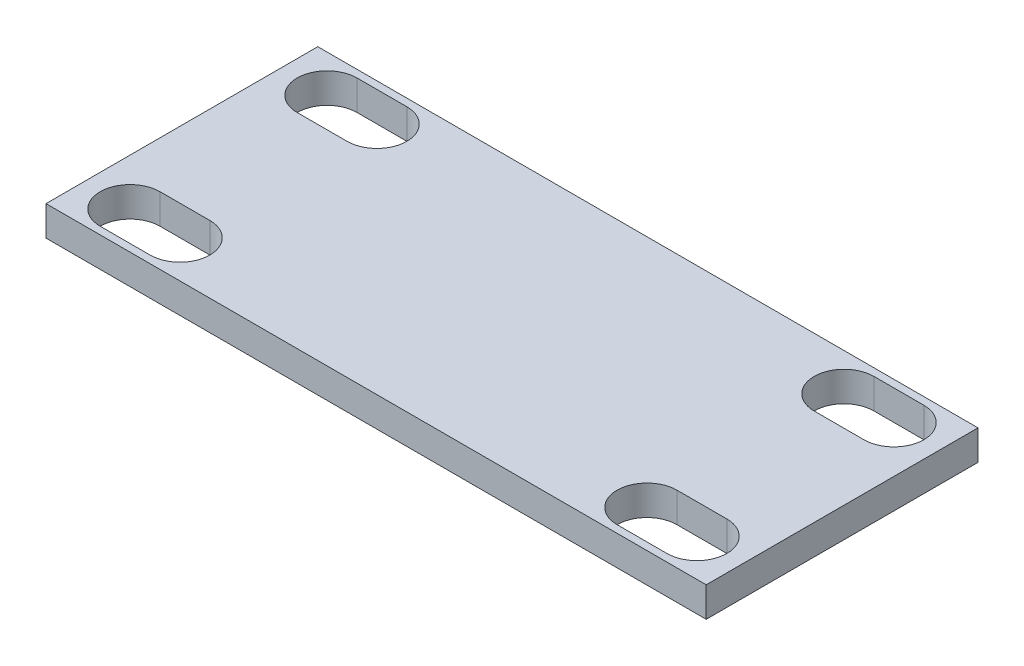
ISO-10303-21;
HEADER;
FILE_DESCRIPTION(('STEP AP214'),'2;1');
FILE_NAME('part.step','',(''),(''),'','','');
FILE_SCHEMA(('AUTOMOTIVE_DESIGN { 1 0 10303 214 1 1 1 1 }'));
ENDSEC;
DATA;
#1=APPLICATION_CONTEXT('core data for automotive mechanical design processes');
#2=APPLICATION_PROTOCOL_DEFINITION('international standard','automotive_design',2000,#1);
#3=PRODUCT_CONTEXT('',#1,'mechanical');
#4=PRODUCT('Part','Part','',(#3));
#5=PRODUCT_RELATED_PRODUCT_CATEGORY('part','',(#4));
#6=PRODUCT_DEFINITION_FORMATION('','',#4);
#7=PRODUCT_DEFINITION_CONTEXT('part definition',#1,'design');
#8=PRODUCT_DEFINITION('design','',#6,#7);
#9=PRODUCT_DEFINITION_SHAPE('','',#8);
#10=(LENGTH_UNIT() NAMED_UNIT(*) SI_UNIT(.MILLI.,.METRE.));
#11=(NAMED_UNIT(*) PLANE_ANGLE_UNIT() SI_UNIT($,.RADIAN.));
#12=(NAMED_UNIT(*) SI_UNIT($,.STERADIAN.) SOLID_ANGLE_UNIT());
#13=UNCERTAINTY_MEASURE_WITH_UNIT(LENGTH_MEASURE(1.E-05),#10,'distance_accuracy_value','');
#14=(GEOMETRIC_REPRESENTATION_CONTEXT(3) GLOBAL_UNCERTAINTY_ASSIGNED_CONTEXT((#13)) GLOBAL_UNIT_ASSIGNED_CONTEXT((#10,
#11,#12)) REPRESENTATION_CONTEXT('',''));
#15=CARTESIAN_POINT('',(0.,0.,0.));
#16=DIRECTION('',(0.,0.,1.));
#17=DIRECTION('',(1.,0.,0.));
#18=AXIS2_PLACEMENT_3D('',#15,#16,#17);
#19=CARTESIAN_POINT('',(0.,3.,0.));
#20=DIRECTION('',(0.,1.,0.));
#21=DIRECTION('',(0.,0.,1.));
#22=AXIS2_PLACEMENT_3D('',#19,#20,#21);
#23=PLANE('',#22);
#24=DIRECTION('',(0.,0.,-1.));
#25=VECTOR('',#24,1.);
#26=CARTESIAN_POINT('',(33.095,3.,-13.625));
#27=LINE('',#26,#25);
#28=CARTESIAN_POINT('',(33.095,3.,13.625));
#29=VERTEX_POINT('',#28);
#30=CARTESIAN_POINT('',(33.095,3.,-13.625));
#31=VERTEX_POINT('',#30);
#32=EDGE_CURVE('E302',#29,#31,#27,.T.);
#33=ORIENTED_EDGE('',*,*,#32,.T.);
#34=DIRECTION('',(-1.,0.,0.));
#35=VECTOR('',#34,1.);
#36=CARTESIAN_POINT('',(-33.095,3.,-13.625));
#37=LINE('',#36,#35);
#38=CARTESIAN_POINT('',(-33.095,3.,-13.625));
#39=VERTEX_POINT('',#38);
#40=EDGE_CURVE('E305',#31,#39,#37,.T.);
#41=ORIENTED_EDGE('',*,*,#40,.T.);
#42=DIRECTION('',(0.,0.,1.));
#43=VECTOR('',#42,1.);
#44=CARTESIAN_POINT('',(-33.095,3.,-13.625));
#45=LINE('',#44,#43);
#46=CARTESIAN_POINT('',(-33.095,3.,13.625));
#47=VERTEX_POINT('',#46);
#48=EDGE_CURVE('E308',#39,#47,#45,.T.);
#49=ORIENTED_EDGE('',*,*,#48,.T.);
#50=DIRECTION('',(1.,0.,0.));
#51=VECTOR('',#50,1.);
#52=CARTESIAN_POINT('',(-33.095,3.,13.625));
#53=LINE('',#52,#51);
#54=EDGE_CURVE('E310',#47,#29,#53,.T.);
#55=ORIENTED_EDGE('',*,*,#54,.T.);
#56=EDGE_LOOP('',(#33,#41,#49,#55));
#57=FACE_BOUND('',#56,.T.);
#58=DIRECTION('',(1.,0.,0.));
#59=VECTOR('',#58,1.);
#60=CARTESIAN_POINT('',(-28.4129443800947,3.,-6.875));
#61=LINE('',#60,#59);
#62=CARTESIAN_POINT('',(-28.4129443800947,3.,-6.875));
#63=VERTEX_POINT('',#62);
#64=CARTESIAN_POINT('',(-23.4129443800947,3.,-6.875));
#65=VERTEX_POINT('',#64);
#66=EDGE_CURVE('E273',#63,#65,#61,.T.);
#67=ORIENTED_EDGE('',*,*,#66,.F.);
#68=CARTESIAN_POINT('',(-28.4129443800947,3.,-9.875));
#69=DIRECTION('',(0.,1.,0.));
#70=DIRECTION('',(0.,0.,1.));
#71=AXIS2_PLACEMENT_3D('',#68,#69,#70);
#72=CIRCLE('',#71,3.);
#73=CARTESIAN_POINT('',(-28.4129443800947,3.,-12.875));
#74=VERTEX_POINT('',#73);
#75=EDGE_CURVE('E271',#74,#63,#72,.T.);
#76=ORIENTED_EDGE('',*,*,#75,.F.);
#77=DIRECTION('',(-1.,0.,0.));
#78=VECTOR('',#77,1.);
#79=CARTESIAN_POINT('',(-28.4129443800947,3.,-12.875));
#80=LINE('',#79,#78);
#81=CARTESIAN_POINT('',(-23.4129443800947,3.,-12.875));
#82=VERTEX_POINT('',#81);
#83=EDGE_CURVE('E279',#82,#74,#80,.T.);
#84=ORIENTED_EDGE('',*,*,#83,.F.);
#85=CARTESIAN_POINT('',(-23.4129443800947,3.,-9.875));
#86=DIRECTION('',(0.,1.,0.));
#87=DIRECTION('',(0.,0.,1.));
#88=AXIS2_PLACEMENT_3D('',#85,#86,#87);
#89=CIRCLE('',#88,3.);
#90=EDGE_CURVE('E276',#65,#82,#89,.T.);
#91=ORIENTED_EDGE('',*,*,#90,.F.);
#92=EDGE_LOOP('',(#67,#76,#84,#91));
#93=FACE_BOUND('',#92,.T.);
#94=DIRECTION('',(-1.,0.,0.));
#95=VECTOR('',#94,1.);
#96=CARTESIAN_POINT('',(28.4129443800946,3.,-12.875));
#97=LINE('',#96,#95);
#98=CARTESIAN_POINT('',(28.4129443800946,3.,-12.875));
#99=VERTEX_POINT('',#98);
#100=CARTESIAN_POINT('',(23.4129443800946,3.,-12.875));
#101=VERTEX_POINT('',#100);
#102=EDGE_CURVE('E242',#99,#101,#97,.T.);
#103=ORIENTED_EDGE('',*,*,#102,.F.);
#104=CARTESIAN_POINT('',(28.4129443800946,3.,-9.875));
#105=DIRECTION('',(0.,1.,0.));
#106=DIRECTION('',(0.,0.,-1.));
#107=AXIS2_PLACEMENT_3D('',#104,#105,#106);
#108=CIRCLE('',#107,3.);
#109=CARTESIAN_POINT('',(28.4129443800946,3.,-6.875));
#110=VERTEX_POINT('',#109);
#111=EDGE_CURVE('E240',#110,#99,#108,.T.);
#112=ORIENTED_EDGE('',*,*,#111,.F.);
#113=DIRECTION('',(1.,0.,0.));
#114=VECTOR('',#113,1.);
#115=CARTESIAN_POINT('',(28.4129443800946,3.,-6.875));
#116=LINE('',#115,#114);
#117=CARTESIAN_POINT('',(23.4129443800946,3.,-6.875));
#118=VERTEX_POINT('',#117);
#119=EDGE_CURVE('E248',#118,#110,#116,.T.);
#120=ORIENTED_EDGE('',*,*,#119,.F.);
#121=CARTESIAN_POINT('',(23.4129443800946,3.,-9.875));
#122=DIRECTION('',(0.,1.,0.));
#123=DIRECTION('',(0.,0.,-1.));
#124=AXIS2_PLACEMENT_3D('',#121,#122,#123);
#125=CIRCLE('',#124,3.);
#126=EDGE_CURVE('E245',#101,#118,#125,.T.);
#127=ORIENTED_EDGE('',*,*,#126,.F.);
#128=EDGE_LOOP('',(#103,#112,#120,#127));
#129=FACE_BOUND('',#128,.T.);
#130=DIRECTION('',(1.,0.,0.));
#131=VECTOR('',#130,1.);
#132=CARTESIAN_POINT('',(-28.4129443800947,3.,12.875));
#133=LINE('',#132,#131);
#134=CARTESIAN_POINT('',(-28.4129443800947,3.,12.875));
#135=VERTEX_POINT('',#134);
#136=CARTESIAN_POINT('',(-23.4129443800947,3.,12.875));
#137=VERTEX_POINT('',#136);
#138=EDGE_CURVE('E211',#135,#137,#133,.T.);
#139=ORIENTED_EDGE('',*,*,#138,.F.);
#140=CARTESIAN_POINT('',(-28.4129443800947,3.,9.87500000000001));
#141=DIRECTION('',(0.,1.,0.));
#142=DIRECTION('',(0.,0.,-1.));
#143=AXIS2_PLACEMENT_3D('',#140,#141,#142);
#144=CIRCLE('',#143,3.);
#145=CARTESIAN_POINT('',(-28.4129443800947,3.,6.87500000000001));
#146=VERTEX_POINT('',#145);
#147=EDGE_CURVE('E209',#146,#135,#144,.T.);
#148=ORIENTED_EDGE('',*,*,#147,.F.);
#149=DIRECTION('',(-1.,0.,0.));
#150=VECTOR('',#149,1.);
#151=CARTESIAN_POINT('',(-28.4129443800947,3.,6.87500000000001));
#152=LINE('',#151,#150);
#153=CARTESIAN_POINT('',(-23.4129443800947,3.,6.87500000000001));
#154=VERTEX_POINT('',#153);
#155=EDGE_CURVE('E217',#154,#146,#152,.T.);
#156=ORIENTED_EDGE('',*,*,#155,.F.);
#157=CARTESIAN_POINT('',(-23.4129443800947,3.,9.87500000000001));
#158=DIRECTION('',(0.,1.,0.));
#159=DIRECTION('',(0.,0.,-1.));
#160=AXIS2_PLACEMENT_3D('',#157,#158,#159);
#161=CIRCLE('',#160,3.);
#162=EDGE_CURVE('E214',#137,#154,#161,.T.);
#163=ORIENTED_EDGE('',*,*,#162,.F.);
#164=EDGE_LOOP('',(#139,#148,#156,#163));
#165=FACE_BOUND('',#164,.T.);
#166=DIRECTION('',(-1.,0.,0.));
#167=VECTOR('',#166,1.);
#168=CARTESIAN_POINT('',(28.4129443800946,3.,6.87500000000001));
#169=LINE('',#168,#167);
#170=CARTESIAN_POINT('',(28.4129443800946,3.,6.87500000000001));
#171=VERTEX_POINT('',#170);
#172=CARTESIAN_POINT('',(23.4129443800946,3.,6.87500000000001));
#173=VERTEX_POINT('',#172);
#174=EDGE_CURVE('E181',#171,#173,#169,.T.);
#175=ORIENTED_EDGE('',*,*,#174,.F.);
#176=CARTESIAN_POINT('',(28.4129443800946,3.,9.87500000000001));
#177=DIRECTION('',(0.,1.,0.));
#178=DIRECTION('',(0.,0.,1.));
#179=AXIS2_PLACEMENT_3D('',#176,#177,#178);
#180=CIRCLE('',#179,3.);
#181=CARTESIAN_POINT('',(28.4129443800946,3.,12.875));
#182=VERTEX_POINT('',#181);
#183=EDGE_CURVE('E173',#182,#171,#180,.T.);
#184=ORIENTED_EDGE('',*,*,#183,.F.);
#185=DIRECTION('',(1.,0.,0.));
#186=VECTOR('',#185,1.);
#187=CARTESIAN_POINT('',(28.4129443800946,3.,12.875));
#188=LINE('',#187,#186);
#189=CARTESIAN_POINT('',(23.4129443800946,3.,12.875));
#190=VERTEX_POINT('',#189);
#191=EDGE_CURVE('E195',#190,#182,#188,.T.);
#192=ORIENTED_EDGE('',*,*,#191,.F.);
#193=CARTESIAN_POINT('',(23.4129443800946,3.,9.87500000000001));
#194=DIRECTION('',(0.,1.,0.));
#195=DIRECTION('',(0.,0.,1.));
#196=AXIS2_PLACEMENT_3D('',#193,#194,#195);
#197=CIRCLE('',#196,3.);
#198=EDGE_CURVE('E193',#173,#190,#197,.T.);
#199=ORIENTED_EDGE('',*,*,#198,.F.);
#200=EDGE_LOOP('',(#175,#184,#192,#199));
#201=FACE_BOUND('',#200,.T.);
#202=ADVANCED_FACE('F36',(#57,#93,#129,#165,#201),#23,.T.);
#203=CARTESIAN_POINT('',(0.,0.,0.));
#204=DIRECTION('',(0.,1.,0.));
#205=DIRECTION('',(0.,0.,1.));
#206=AXIS2_PLACEMENT_3D('',#203,#204,#205);
#207=PLANE('',#206);
#208=CARTESIAN_POINT('',(-28.4129443800947,0.,9.87500000000001));
#209=DIRECTION('',(0.,1.,0.));
#210=DIRECTION('',(0.,0.,-1.));
#211=AXIS2_PLACEMENT_3D('',#208,#209,#210);
#212=CIRCLE('',#211,3.);
#213=CARTESIAN_POINT('',(-28.4129443800947,0.,6.87500000000001));
#214=VERTEX_POINT('',#213);
#215=CARTESIAN_POINT('',(-28.4129443800947,0.,12.875));
#216=VERTEX_POINT('',#215);
#217=EDGE_CURVE('E189',#214,#216,#212,.T.);
#218=ORIENTED_EDGE('',*,*,#217,.T.);
#219=DIRECTION('',(1.,0.,0.));
#220=VECTOR('',#219,1.);
#221=CARTESIAN_POINT('',(-28.4129443800947,0.,12.875));
#222=LINE('',#221,#220);
#223=CARTESIAN_POINT('',(-23.4129443800947,0.,12.875));
#224=VERTEX_POINT('',#223);
#225=EDGE_CURVE('E222',#216,#224,#222,.T.);
#226=ORIENTED_EDGE('',*,*,#225,.T.);
#227=CARTESIAN_POINT('',(-23.4129443800947,0.,9.87500000000001));
#228=DIRECTION('',(0.,1.,0.));
#229=DIRECTION('',(0.,0.,-1.));
#230=AXIS2_PLACEMENT_3D('',#227,#228,#229);
#231=CIRCLE('',#230,3.);
#232=CARTESIAN_POINT('',(-23.4129443800947,0.,6.87500000000001));
#233=VERTEX_POINT('',#232);
#234=EDGE_CURVE('E225',#224,#233,#231,.T.);
#235=ORIENTED_EDGE('',*,*,#234,.T.);
#236=DIRECTION('',(-1.,0.,0.));
#237=VECTOR('',#236,1.);
#238=CARTESIAN_POINT('',(-28.4129443800947,0.,6.87500000000001));
#239=LINE('',#238,#237);
#240=EDGE_CURVE('E212',#233,#214,#239,.T.);
#241=ORIENTED_EDGE('',*,*,#240,.T.);
#242=EDGE_LOOP('',(#218,#226,#235,#241));
#243=FACE_BOUND('',#242,.T.);
#244=CARTESIAN_POINT('',(-28.4129443800947,0.,-9.875));
#245=DIRECTION('',(0.,1.,0.));
#246=DIRECTION('',(0.,0.,1.));
#247=AXIS2_PLACEMENT_3D('',#244,#245,#246);
#248=CIRCLE('',#247,3.);
#249=CARTESIAN_POINT('',(-28.4129443800947,0.,-12.875));
#250=VERTEX_POINT('',#249);
#251=CARTESIAN_POINT('',(-28.4129443800947,0.,-6.875));
#252=VERTEX_POINT('',#251);
#253=EDGE_CURVE('E270',#250,#252,#248,.T.);
#254=ORIENTED_EDGE('',*,*,#253,.T.);
#255=DIRECTION('',(1.,0.,0.));
#256=VECTOR('',#255,1.);
#257=CARTESIAN_POINT('',(-28.4129443800947,0.,-6.875));
#258=LINE('',#257,#256);
#259=CARTESIAN_POINT('',(-23.4129443800947,0.,-6.875));
#260=VERTEX_POINT('',#259);
#261=EDGE_CURVE('E284',#252,#260,#258,.T.);
#262=ORIENTED_EDGE('',*,*,#261,.T.);
#263=CARTESIAN_POINT('',(-23.4129443800947,0.,-9.875));
#264=DIRECTION('',(0.,1.,0.));
#265=DIRECTION('',(0.,0.,1.));
#266=AXIS2_PLACEMENT_3D('',#263,#264,#265);
#267=CIRCLE('',#266,3.);
#268=CARTESIAN_POINT('',(-23.4129443800947,0.,-12.875));
#269=VERTEX_POINT('',#268);
#270=EDGE_CURVE('E287',#260,#269,#267,.T.);
#271=ORIENTED_EDGE('',*,*,#270,.T.);
#272=DIRECTION('',(-1.,0.,0.));
#273=VECTOR('',#272,1.);
#274=CARTESIAN_POINT('',(-28.4129443800947,0.,-12.875));
#275=LINE('',#274,#273);
#276=EDGE_CURVE('E274',#269,#250,#275,.T.);
#277=ORIENTED_EDGE('',*,*,#276,.T.);
#278=EDGE_LOOP('',(#254,#262,#271,#277));
#279=FACE_BOUND('',#278,.T.);
#280=DIRECTION('',(0.,0.,-1.));
#281=VECTOR('',#280,1.);
#282=CARTESIAN_POINT('',(33.095,0.,-13.625));
#283=LINE('',#282,#281);
#284=CARTESIAN_POINT('',(33.095,0.,13.625));
#285=VERTEX_POINT('',#284);
#286=CARTESIAN_POINT('',(33.095,0.,-13.625));
#287=VERTEX_POINT('',#286);
#288=EDGE_CURVE('E301',#285,#287,#283,.T.);
#289=ORIENTED_EDGE('',*,*,#288,.F.);
#290=DIRECTION('',(1.,0.,0.));
#291=VECTOR('',#290,1.);
#292=CARTESIAN_POINT('',(-33.095,0.,13.625));
#293=LINE('',#292,#291);
#294=CARTESIAN_POINT('',(-33.095,0.,13.625));
#295=VERTEX_POINT('',#294);
#296=EDGE_CURVE('E306',#295,#285,#293,.T.);
#297=ORIENTED_EDGE('',*,*,#296,.F.);
#298=DIRECTION('',(0.,0.,1.));
#299=VECTOR('',#298,1.);
#300=CARTESIAN_POINT('',(-33.095,0.,-13.625));
#301=LINE('',#300,#299);
#302=CARTESIAN_POINT('',(-33.095,0.,-13.625));
#303=VERTEX_POINT('',#302);
#304=EDGE_CURVE('E317',#303,#295,#301,.T.);
#305=ORIENTED_EDGE('',*,*,#304,.F.);
#306=DIRECTION('',(-1.,0.,0.));
#307=VECTOR('',#306,1.);
#308=CARTESIAN_POINT('',(-33.095,0.,-13.625));
#309=LINE('',#308,#307);
#310=EDGE_CURVE('E315',#287,#303,#309,.T.);
#311=ORIENTED_EDGE('',*,*,#310,.F.);
#312=EDGE_LOOP('',(#289,#297,#305,#311));
#313=FACE_BOUND('',#312,.T.);
#314=CARTESIAN_POINT('',(28.4129443800946,0.,-9.875));
#315=DIRECTION('',(0.,1.,0.));
#316=DIRECTION('',(0.,0.,-1.));
#317=AXIS2_PLACEMENT_3D('',#314,#315,#316);
#318=CIRCLE('',#317,3.);
#319=CARTESIAN_POINT('',(28.4129443800946,0.,-6.875));
#320=VERTEX_POINT('',#319);
#321=CARTESIAN_POINT('',(28.4129443800946,0.,-12.875));
#322=VERTEX_POINT('',#321);
#323=EDGE_CURVE('E239',#320,#322,#318,.T.);
#324=ORIENTED_EDGE('',*,*,#323,.T.);
#325=DIRECTION('',(-1.,0.,0.));
#326=VECTOR('',#325,1.);
#327=CARTESIAN_POINT('',(28.4129443800946,0.,-12.875));
#328=LINE('',#327,#326);
#329=CARTESIAN_POINT('',(23.4129443800946,0.,-12.875));
#330=VERTEX_POINT('',#329);
#331=EDGE_CURVE('E253',#322,#330,#328,.T.);
#332=ORIENTED_EDGE('',*,*,#331,.T.);
#333=CARTESIAN_POINT('',(23.4129443800946,0.,-9.875));
#334=DIRECTION('',(0.,1.,0.));
#335=DIRECTION('',(0.,0.,-1.));
#336=AXIS2_PLACEMENT_3D('',#333,#334,#335);
#337=CIRCLE('',#336,3.);
#338=CARTESIAN_POINT('',(23.4129443800946,0.,-6.875));
#339=VERTEX_POINT('',#338);
#340=EDGE_CURVE('E256',#330,#339,#337,.T.);
#341=ORIENTED_EDGE('',*,*,#340,.T.);
#342=DIRECTION('',(1.,0.,0.));
#343=VECTOR('',#342,1.);
#344=CARTESIAN_POINT('',(28.4129443800946,0.,-6.875));
#345=LINE('',#344,#343);
#346=EDGE_CURVE('E243',#339,#320,#345,.T.);
#347=ORIENTED_EDGE('',*,*,#346,.T.);
#348=EDGE_LOOP('',(#324,#332,#341,#347));
#349=FACE_BOUND('',#348,.T.);
#350=CARTESIAN_POINT('',(28.4129443800946,0.,9.87500000000001));
#351=DIRECTION('',(0.,1.,0.));
#352=DIRECTION('',(0.,0.,1.));
#353=AXIS2_PLACEMENT_3D('',#350,#351,#352);
#354=CIRCLE('',#353,3.);
#355=CARTESIAN_POINT('',(28.4129443800946,0.,12.875));
#356=VERTEX_POINT('',#355);
#357=CARTESIAN_POINT('',(28.4129443800946,0.,6.87500000000001));
#358=VERTEX_POINT('',#357);
#359=EDGE_CURVE('E59',#356,#358,#354,.T.);
#360=ORIENTED_EDGE('',*,*,#359,.T.);
#361=DIRECTION('',(-1.,0.,0.));
#362=VECTOR('',#361,1.);
#363=CARTESIAN_POINT('',(28.4129443800946,0.,6.87500000000001));
#364=LINE('',#363,#362);
#365=CARTESIAN_POINT('',(23.4129443800946,0.,6.87500000000001));
#366=VERTEX_POINT('',#365);
#367=EDGE_CURVE('E188',#358,#366,#364,.T.);
#368=ORIENTED_EDGE('',*,*,#367,.T.);
#369=CARTESIAN_POINT('',(23.4129443800946,0.,9.87500000000001));
#370=DIRECTION('',(0.,1.,0.));
#371=DIRECTION('',(0.,0.,1.));
#372=AXIS2_PLACEMENT_3D('',#369,#370,#371);
#373=CIRCLE('',#372,3.);
#374=CARTESIAN_POINT('',(23.4129443800946,0.,12.875));
#375=VERTEX_POINT('',#374);
#376=EDGE_CURVE('E201',#366,#375,#373,.T.);
#377=ORIENTED_EDGE('',*,*,#376,.T.);
#378=DIRECTION('',(1.,0.,0.));
#379=VECTOR('',#378,1.);
#380=CARTESIAN_POINT('',(28.4129443800946,0.,12.875));
#381=LINE('',#380,#379);
#382=EDGE_CURVE('E182',#375,#356,#381,.T.);
#383=ORIENTED_EDGE('',*,*,#382,.T.);
#384=EDGE_LOOP('',(#360,#368,#377,#383));
#385=FACE_BOUND('',#384,.T.);
#386=ADVANCED_FACE('F335',(#243,#279,#313,#349,#385),#207,.F.);
#387=CARTESIAN_POINT('',(33.095,3.,-13.625));
#388=DIRECTION('',(-1.,0.,0.));
#389=DIRECTION('',(0.,0.,1.));
#390=AXIS2_PLACEMENT_3D('',#387,#388,#389);
#391=PLANE('',#390);
#392=ORIENTED_EDGE('',*,*,#288,.T.);
#393=DIRECTION('',(0.,-1.,0.));
#394=VECTOR('',#393,1.);
#395=CARTESIAN_POINT('',(33.095,3.,-13.625));
#396=LINE('',#395,#394);
#397=EDGE_CURVE('E11',#31,#287,#396,.T.);
#398=ORIENTED_EDGE('',*,*,#397,.F.);
#399=ORIENTED_EDGE('',*,*,#32,.F.);
#400=DIRECTION('',(0.,-1.,0.));
#401=VECTOR('',#400,1.);
#402=CARTESIAN_POINT('',(33.095,3.,13.625));
#403=LINE('',#402,#401);
#404=EDGE_CURVE('E312',#29,#285,#403,.T.);
#405=ORIENTED_EDGE('',*,*,#404,.T.);
#406=EDGE_LOOP('',(#392,#398,#399,#405));
#407=FACE_BOUND('',#406,.T.);
#408=ADVANCED_FACE('F38',(#407),#391,.F.);
#409=CARTESIAN_POINT('',(-33.095,3.,-13.625));
#410=DIRECTION('',(0.,0.,1.));
#411=DIRECTION('',(1.,0.,0.));
#412=AXIS2_PLACEMENT_3D('',#409,#410,#411);
#413=PLANE('',#412);
#414=ORIENTED_EDGE('',*,*,#310,.T.);
#415=DIRECTION('',(0.,-1.,0.));
#416=VECTOR('',#415,1.);
#417=CARTESIAN_POINT('',(-33.095,3.,-13.625));
#418=LINE('',#417,#416);
#419=EDGE_CURVE('E44',#39,#303,#418,.T.);
#420=ORIENTED_EDGE('',*,*,#419,.F.);
#421=ORIENTED_EDGE('',*,*,#40,.F.);
#422=ORIENTED_EDGE('',*,*,#397,.T.);
#423=EDGE_LOOP('',(#414,#420,#421,#422));
#424=FACE_BOUND('',#423,.T.);
#425=ADVANCED_FACE('F346',(#424),#413,.F.);
#426=CARTESIAN_POINT('',(-33.095,3.,-13.625));
#427=DIRECTION('',(1.,0.,0.));
#428=DIRECTION('',(0.,0.,-1.));
#429=AXIS2_PLACEMENT_3D('',#426,#427,#428);
#430=PLANE('',#429);
#431=ORIENTED_EDGE('',*,*,#304,.T.);
#432=DIRECTION('',(0.,-1.,0.));
#433=VECTOR('',#432,1.);
#434=CARTESIAN_POINT('',(-33.095,3.,13.625));
#435=LINE('',#434,#433);
#436=EDGE_CURVE('E322',#47,#295,#435,.T.);
#437=ORIENTED_EDGE('',*,*,#436,.F.);
#438=ORIENTED_EDGE('',*,*,#48,.F.);
#439=ORIENTED_EDGE('',*,*,#419,.T.);
#440=EDGE_LOOP('',(#431,#437,#438,#439));
#441=FACE_BOUND('',#440,.T.);
#442=ADVANCED_FACE('F329',(#441),#430,.F.);
#443=CARTESIAN_POINT('',(-33.095,3.,13.625));
#444=DIRECTION('',(0.,0.,-1.));
#445=DIRECTION('',(-1.,0.,0.));
#446=AXIS2_PLACEMENT_3D('',#443,#444,#445);
#447=PLANE('',#446);
#448=ORIENTED_EDGE('',*,*,#296,.T.);
#449=ORIENTED_EDGE('',*,*,#404,.F.);
#450=ORIENTED_EDGE('',*,*,#54,.F.);
#451=ORIENTED_EDGE('',*,*,#436,.T.);
#452=EDGE_LOOP('',(#448,#449,#450,#451));
#453=FACE_BOUND('',#452,.T.);
#454=ADVANCED_FACE('F339',(#453),#447,.F.);
#455=CARTESIAN_POINT('',(-28.4129443800947,3.,-9.875));
#456=DIRECTION('',(0.,-1.,0.));
#457=DIRECTION('',(0.,0.,-1.));
#458=AXIS2_PLACEMENT_3D('',#455,#456,#457);
#459=CYLINDRICAL_SURFACE('',#458,3.);
#460=ORIENTED_EDGE('',*,*,#253,.F.);
#461=DIRECTION('',(0.,-1.,0.));
#462=VECTOR('',#461,1.);
#463=CARTESIAN_POINT('',(-28.4129443800947,3.,-12.875));
#464=LINE('',#463,#462);
#465=EDGE_CURVE('E281',#74,#250,#464,.T.);
#466=ORIENTED_EDGE('',*,*,#465,.F.);
#467=ORIENTED_EDGE('',*,*,#75,.T.);
#468=DIRECTION('',(0.,-1.,0.));
#469=VECTOR('',#468,1.);
#470=CARTESIAN_POINT('',(-28.4129443800947,3.,-6.875));
#471=LINE('',#470,#469);
#472=EDGE_CURVE('E298',#63,#252,#471,.T.);
#473=ORIENTED_EDGE('',*,*,#472,.T.);
#474=EDGE_LOOP('',(#460,#466,#467,#473));
#475=FACE_BOUND('',#474,.T.);
#476=ADVANCED_FACE('F361',(#475),#459,.F.);
#477=CARTESIAN_POINT('',(-28.4129443800947,3.,-6.875));
#478=DIRECTION('',(0.,0.,-1.));
#479=DIRECTION('',(-1.,0.,0.));
#480=AXIS2_PLACEMENT_3D('',#477,#478,#479);
#481=PLANE('',#480);
#482=ORIENTED_EDGE('',*,*,#261,.F.);
#483=ORIENTED_EDGE('',*,*,#472,.F.);
#484=ORIENTED_EDGE('',*,*,#66,.T.);
#485=DIRECTION('',(0.,-1.,0.));
#486=VECTOR('',#485,1.);
#487=CARTESIAN_POINT('',(-23.4129443800947,3.,-6.875));
#488=LINE('',#487,#486);
#489=EDGE_CURVE('E296',#65,#260,#488,.T.);
#490=ORIENTED_EDGE('',*,*,#489,.T.);
#491=EDGE_LOOP('',(#482,#483,#484,#490));
#492=FACE_BOUND('',#491,.T.);
#493=ADVANCED_FACE('F368',(#492),#481,.T.);
#494=CARTESIAN_POINT('',(-23.4129443800947,3.,-9.875));
#495=DIRECTION('',(0.,-1.,0.));
#496=DIRECTION('',(0.,0.,-1.));
#497=AXIS2_PLACEMENT_3D('',#494,#495,#496);
#498=CYLINDRICAL_SURFACE('',#497,3.);
#499=ORIENTED_EDGE('',*,*,#270,.F.);
#500=ORIENTED_EDGE('',*,*,#489,.F.);
#501=ORIENTED_EDGE('',*,*,#90,.T.);
#502=DIRECTION('',(0.,-1.,0.));
#503=VECTOR('',#502,1.);
#504=CARTESIAN_POINT('',(-23.4129443800947,3.,-12.875));
#505=LINE('',#504,#503);
#506=EDGE_CURVE('E294',#82,#269,#505,.T.);
#507=ORIENTED_EDGE('',*,*,#506,.T.);
#508=EDGE_LOOP('',(#499,#500,#501,#507));
#509=FACE_BOUND('',#508,.T.);
#510=ADVANCED_FACE('F373',(#509),#498,.F.);
#511=CARTESIAN_POINT('',(-28.4129443800947,3.,-12.875));
#512=DIRECTION('',(0.,0.,1.));
#513=DIRECTION('',(1.,0.,0.));
#514=AXIS2_PLACEMENT_3D('',#511,#512,#513);
#515=PLANE('',#514);
#516=ORIENTED_EDGE('',*,*,#276,.F.);
#517=ORIENTED_EDGE('',*,*,#506,.F.);
#518=ORIENTED_EDGE('',*,*,#83,.T.);
#519=ORIENTED_EDGE('',*,*,#465,.T.);
#520=EDGE_LOOP('',(#516,#517,#518,#519));
#521=FACE_BOUND('',#520,.T.);
#522=ADVANCED_FACE('F381',(#521),#515,.T.);
#523=CARTESIAN_POINT('',(28.4129443800946,3.,-9.875));
#524=DIRECTION('',(0.,-1.,0.));
#525=DIRECTION('',(0.,0.,-1.));
#526=AXIS2_PLACEMENT_3D('',#523,#524,#525);
#527=CYLINDRICAL_SURFACE('',#526,3.);
#528=ORIENTED_EDGE('',*,*,#323,.F.);
#529=DIRECTION('',(0.,-1.,0.));
#530=VECTOR('',#529,1.);
#531=CARTESIAN_POINT('',(28.4129443800946,3.,-6.875));
#532=LINE('',#531,#530);
#533=EDGE_CURVE('E250',#110,#320,#532,.T.);
#534=ORIENTED_EDGE('',*,*,#533,.F.);
#535=ORIENTED_EDGE('',*,*,#111,.T.);
#536=DIRECTION('',(0.,-1.,0.));
#537=VECTOR('',#536,1.);
#538=CARTESIAN_POINT('',(28.4129443800946,3.,-12.875));
#539=LINE('',#538,#537);
#540=EDGE_CURVE('E267',#99,#322,#539,.T.);
#541=ORIENTED_EDGE('',*,*,#540,.T.);
#542=EDGE_LOOP('',(#528,#534,#535,#541));
#543=FACE_BOUND('',#542,.T.);
#544=ADVANCED_FACE('F435',(#543),#527,.F.);
#545=CARTESIAN_POINT('',(28.4129443800946,3.,-12.875));
#546=DIRECTION('',(0.,0.,1.));
#547=DIRECTION('',(1.,0.,0.));
#548=AXIS2_PLACEMENT_3D('',#545,#546,#547);
#549=PLANE('',#548);
#550=ORIENTED_EDGE('',*,*,#331,.F.);
#551=ORIENTED_EDGE('',*,*,#540,.F.);
#552=ORIENTED_EDGE('',*,*,#102,.T.);
#553=DIRECTION('',(0.,-1.,0.));
#554=VECTOR('',#553,1.);
#555=CARTESIAN_POINT('',(23.4129443800946,3.,-12.875));
#556=LINE('',#555,#554);
#557=EDGE_CURVE('E265',#101,#330,#556,.T.);
#558=ORIENTED_EDGE('',*,*,#557,.T.);
#559=EDGE_LOOP('',(#550,#551,#552,#558));
#560=FACE_BOUND('',#559,.T.);
#561=ADVANCED_FACE('F431',(#560),#549,.T.);
#562=CARTESIAN_POINT('',(23.4129443800946,3.,-9.875));
#563=DIRECTION('',(0.,-1.,0.));
#564=DIRECTION('',(0.,0.,-1.));
#565=AXIS2_PLACEMENT_3D('',#562,#563,#564);
#566=CYLINDRICAL_SURFACE('',#565,3.);
#567=ORIENTED_EDGE('',*,*,#340,.F.);
#568=ORIENTED_EDGE('',*,*,#557,.F.);
#569=ORIENTED_EDGE('',*,*,#126,.T.);
#570=DIRECTION('',(0.,-1.,0.));
#571=VECTOR('',#570,1.);
#572=CARTESIAN_POINT('',(23.4129443800946,3.,-6.875));
#573=LINE('',#572,#571);
#574=EDGE_CURVE('E263',#118,#339,#573,.T.);
#575=ORIENTED_EDGE('',*,*,#574,.T.);
#576=EDGE_LOOP('',(#567,#568,#569,#575));
#577=FACE_BOUND('',#576,.T.);
#578=ADVANCED_FACE('F427',(#577),#566,.F.);
#579=CARTESIAN_POINT('',(28.4129443800946,3.,-6.875));
#580=DIRECTION('',(0.,0.,-1.));
#581=DIRECTION('',(-1.,0.,0.));
#582=AXIS2_PLACEMENT_3D('',#579,#580,#581);
#583=PLANE('',#582);
#584=ORIENTED_EDGE('',*,*,#346,.F.);
#585=ORIENTED_EDGE('',*,*,#574,.F.);
#586=ORIENTED_EDGE('',*,*,#119,.T.);
#587=ORIENTED_EDGE('',*,*,#533,.T.);
#588=EDGE_LOOP('',(#584,#585,#586,#587));
#589=FACE_BOUND('',#588,.T.);
#590=ADVANCED_FACE('F424',(#589),#583,.T.);
#591=CARTESIAN_POINT('',(-28.4129443800947,3.,9.87500000000001));
#592=DIRECTION('',(0.,-1.,0.));
#593=DIRECTION('',(0.,0.,-1.));
#594=AXIS2_PLACEMENT_3D('',#591,#592,#593);
#595=CYLINDRICAL_SURFACE('',#594,3.);
#596=ORIENTED_EDGE('',*,*,#217,.F.);
#597=DIRECTION('',(0.,-1.,0.));
#598=VECTOR('',#597,1.);
#599=CARTESIAN_POINT('',(-28.4129443800947,3.,6.87500000000001));
#600=LINE('',#599,#598);
#601=EDGE_CURVE('E219',#146,#214,#600,.T.);
#602=ORIENTED_EDGE('',*,*,#601,.F.);
#603=ORIENTED_EDGE('',*,*,#147,.T.);
#604=DIRECTION('',(0.,-1.,0.));
#605=VECTOR('',#604,1.);
#606=CARTESIAN_POINT('',(-28.4129443800947,3.,12.875));
#607=LINE('',#606,#605);
#608=EDGE_CURVE('E236',#135,#216,#607,.T.);
#609=ORIENTED_EDGE('',*,*,#608,.T.);
#610=EDGE_LOOP('',(#596,#602,#603,#609));
#611=FACE_BOUND('',#610,.T.);
#612=ADVANCED_FACE('F406',(#611),#595,.F.);
#613=CARTESIAN_POINT('',(-28.4129443800947,3.,12.875));
#614=DIRECTION('',(0.,0.,-1.));
#615=DIRECTION('',(-1.,0.,0.));
#616=AXIS2_PLACEMENT_3D('',#613,#614,#615);
#617=PLANE('',#616);
#618=ORIENTED_EDGE('',*,*,#225,.F.);
#619=ORIENTED_EDGE('',*,*,#608,.F.);
#620=ORIENTED_EDGE('',*,*,#138,.T.);
#621=DIRECTION('',(0.,-1.,0.));
#622=VECTOR('',#621,1.);
#623=CARTESIAN_POINT('',(-23.4129443800947,3.,12.875));
#624=LINE('',#623,#622);
#625=EDGE_CURVE('E234',#137,#224,#624,.T.);
#626=ORIENTED_EDGE('',*,*,#625,.T.);
#627=EDGE_LOOP('',(#618,#619,#620,#626));
#628=FACE_BOUND('',#627,.T.);
#629=ADVANCED_FACE('F400',(#628),#617,.T.);
#630=CARTESIAN_POINT('',(-23.4129443800947,3.,9.87500000000001));
#631=DIRECTION('',(0.,-1.,0.));
#632=DIRECTION('',(0.,0.,-1.));
#633=AXIS2_PLACEMENT_3D('',#630,#631,#632);
#634=CYLINDRICAL_SURFACE('',#633,3.);
#635=ORIENTED_EDGE('',*,*,#234,.F.);
#636=ORIENTED_EDGE('',*,*,#625,.F.);
#637=ORIENTED_EDGE('',*,*,#162,.T.);
#638=DIRECTION('',(0.,-1.,0.));
#639=VECTOR('',#638,1.);
#640=CARTESIAN_POINT('',(-23.4129443800947,3.,6.87500000000001));
#641=LINE('',#640,#639);
#642=EDGE_CURVE('E232',#154,#233,#641,.T.);
#643=ORIENTED_EDGE('',*,*,#642,.T.);
#644=EDGE_LOOP('',(#635,#636,#637,#643));
#645=FACE_BOUND('',#644,.T.);
#646=ADVANCED_FACE('F403',(#645),#634,.F.);
#647=CARTESIAN_POINT('',(-28.4129443800947,3.,6.87500000000001));
#648=DIRECTION('',(0.,0.,1.));
#649=DIRECTION('',(1.,0.,0.));
#650=AXIS2_PLACEMENT_3D('',#647,#648,#649);
#651=PLANE('',#650);
#652=ORIENTED_EDGE('',*,*,#240,.F.);
#653=ORIENTED_EDGE('',*,*,#642,.F.);
#654=ORIENTED_EDGE('',*,*,#155,.T.);
#655=ORIENTED_EDGE('',*,*,#601,.T.);
#656=EDGE_LOOP('',(#652,#653,#654,#655));
#657=FACE_BOUND('',#656,.T.);
#658=ADVANCED_FACE('F409',(#657),#651,.T.);
#659=CARTESIAN_POINT('',(28.4129443800946,3.,9.87500000000001));
#660=DIRECTION('',(0.,-1.,0.));
#661=DIRECTION('',(0.,0.,-1.));
#662=AXIS2_PLACEMENT_3D('',#659,#660,#661);
#663=CYLINDRICAL_SURFACE('',#662,3.);
#664=ORIENTED_EDGE('',*,*,#359,.F.);
#665=DIRECTION('',(0.,-1.,0.));
#666=VECTOR('',#665,1.);
#667=CARTESIAN_POINT('',(28.4129443800946,3.,12.875));
#668=LINE('',#667,#666);
#669=EDGE_CURVE('E177',#182,#356,#668,.T.);
#670=ORIENTED_EDGE('',*,*,#669,.F.);
#671=ORIENTED_EDGE('',*,*,#183,.T.);
#672=DIRECTION('',(0.,-1.,0.));
#673=VECTOR('',#672,1.);
#674=CARTESIAN_POINT('',(28.4129443800946,3.,6.87500000000001));
#675=LINE('',#674,#673);
#676=EDGE_CURVE('E176',#171,#358,#675,.T.);
#677=ORIENTED_EDGE('',*,*,#676,.T.);
#678=EDGE_LOOP('',(#664,#670,#671,#677));
#679=FACE_BOUND('',#678,.T.);
#680=ADVANCED_FACE('F175',(#679),#663,.F.);
#681=CARTESIAN_POINT('',(28.4129443800946,3.,6.87500000000001));
#682=DIRECTION('',(0.,0.,1.));
#683=DIRECTION('',(1.,0.,0.));
#684=AXIS2_PLACEMENT_3D('',#681,#682,#683);
#685=PLANE('',#684);
#686=ORIENTED_EDGE('',*,*,#367,.F.);
#687=ORIENTED_EDGE('',*,*,#676,.F.);
#688=ORIENTED_EDGE('',*,*,#174,.T.);
#689=DIRECTION('',(0.,-1.,0.));
#690=VECTOR('',#689,1.);
#691=CARTESIAN_POINT('',(23.4129443800946,3.,6.87500000000001));
#692=LINE('',#691,#690);
#693=EDGE_CURVE('E190',#173,#366,#692,.T.);
#694=ORIENTED_EDGE('',*,*,#693,.T.);
#695=EDGE_LOOP('',(#686,#687,#688,#694));
#696=FACE_BOUND('',#695,.T.);
#697=ADVANCED_FACE('F185',(#696),#685,.T.);
#698=CARTESIAN_POINT('',(23.4129443800946,3.,9.87500000000001));
#699=DIRECTION('',(0.,-1.,0.));
#700=DIRECTION('',(0.,0.,-1.));
#701=AXIS2_PLACEMENT_3D('',#698,#699,#700);
#702=CYLINDRICAL_SURFACE('',#701,3.);
#703=ORIENTED_EDGE('',*,*,#376,.F.);
#704=ORIENTED_EDGE('',*,*,#693,.F.);
#705=ORIENTED_EDGE('',*,*,#198,.T.);
#706=DIRECTION('',(0.,-1.,0.));
#707=VECTOR('',#706,1.);
#708=CARTESIAN_POINT('',(23.4129443800946,3.,12.875));
#709=LINE('',#708,#707);
#710=EDGE_CURVE('E51',#190,#375,#709,.T.);
#711=ORIENTED_EDGE('',*,*,#710,.T.);
#712=EDGE_LOOP('',(#703,#704,#705,#711));
#713=FACE_BOUND('',#712,.T.);
#714=ADVANCED_FACE('F498',(#713),#702,.F.);
#715=CARTESIAN_POINT('',(28.4129443800946,3.,12.875));
#716=DIRECTION('',(0.,0.,-1.));
#717=DIRECTION('',(-1.,0.,0.));
#718=AXIS2_PLACEMENT_3D('',#715,#716,#717);
#719=PLANE('',#718);
#720=ORIENTED_EDGE('',*,*,#382,.F.);
#721=ORIENTED_EDGE('',*,*,#710,.F.);
#722=ORIENTED_EDGE('',*,*,#191,.T.);
#723=ORIENTED_EDGE('',*,*,#669,.T.);
#724=EDGE_LOOP('',(#720,#721,#722,#723));
#725=FACE_BOUND('',#724,.T.);
#726=ADVANCED_FACE('F506',(#725),#719,.T.);
#727=CLOSED_SHELL('',(#202,#386,#408,#425,#442,#454,#476,#493,#510,#522,#544,#561,#578,#590,
#612,#629,#646,#658,#680,#697,#714,#726));
#728=MANIFOLD_SOLID_BREP('B2',#727);
#729=ADVANCED_BREP_SHAPE_REPRESENTATION('',(#18,#728),#14);
#730=SHAPE_DEFINITION_REPRESENTATION(#9,#729);
ENDSEC;
END-ISO-10303-21;
